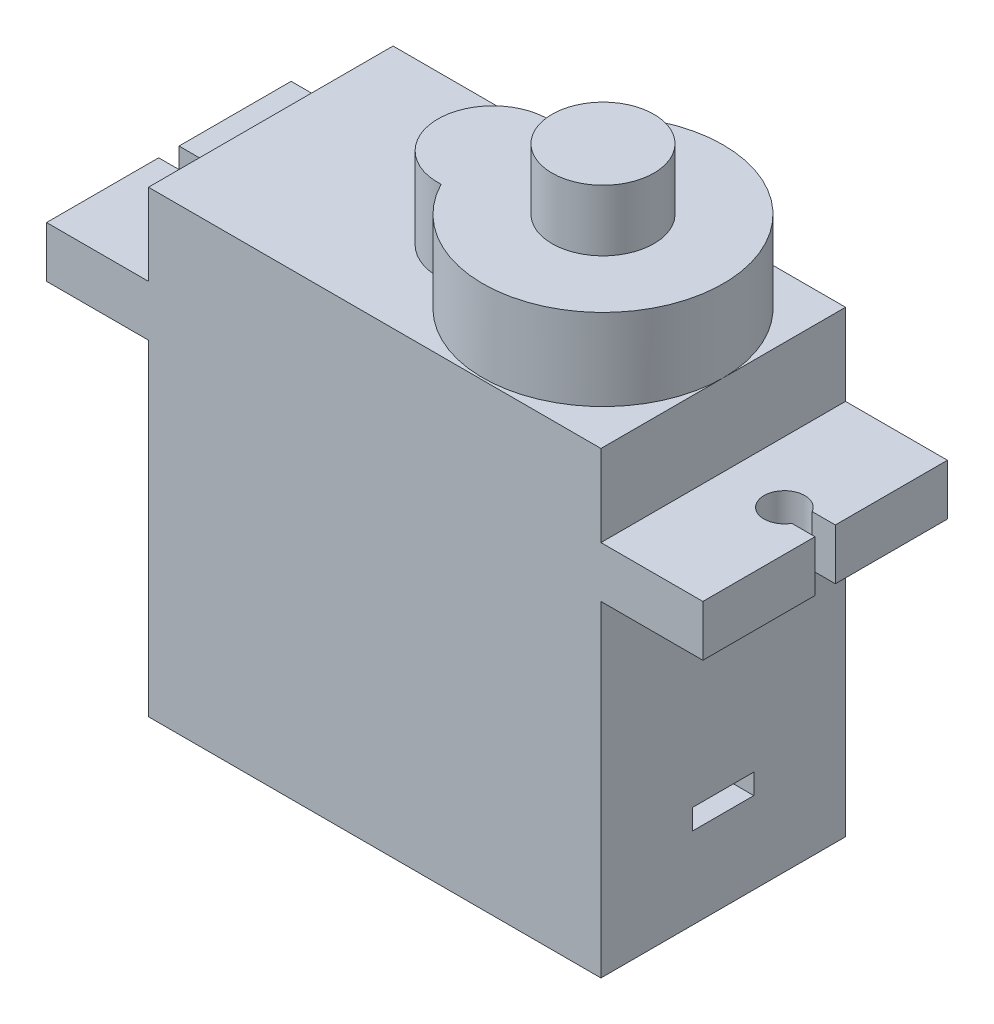
ISO-10303-21;
HEADER;
FILE_DESCRIPTION(('STEP AP214'),'2;1');
FILE_NAME('part.step','',(''),(''),'','','');
FILE_SCHEMA(('AUTOMOTIVE_DESIGN { 1 0 10303 214 1 1 1 1 }'));
ENDSEC;
DATA;
#1=APPLICATION_CONTEXT('core data for automotive mechanical design processes');
#2=APPLICATION_PROTOCOL_DEFINITION('international standard','automotive_design',2000,#1);
#3=PRODUCT_CONTEXT('',#1,'mechanical');
#4=PRODUCT('Part','Part','',(#3));
#5=PRODUCT_RELATED_PRODUCT_CATEGORY('part','',(#4));
#6=PRODUCT_DEFINITION_FORMATION('','',#4);
#7=PRODUCT_DEFINITION_CONTEXT('part definition',#1,'design');
#8=PRODUCT_DEFINITION('design','',#6,#7);
#9=PRODUCT_DEFINITION_SHAPE('','',#8);
#10=(LENGTH_UNIT() NAMED_UNIT(*) SI_UNIT(.MILLI.,.METRE.));
#11=(NAMED_UNIT(*) PLANE_ANGLE_UNIT() SI_UNIT($,.RADIAN.));
#12=(NAMED_UNIT(*) SI_UNIT($,.STERADIAN.) SOLID_ANGLE_UNIT());
#13=UNCERTAINTY_MEASURE_WITH_UNIT(LENGTH_MEASURE(1.E-05),#10,'distance_accuracy_value','');
#14=(GEOMETRIC_REPRESENTATION_CONTEXT(3) GLOBAL_UNCERTAINTY_ASSIGNED_CONTEXT((#13)) GLOBAL_UNIT_ASSIGNED_CONTEXT((#10,
#11,#12)) REPRESENTATION_CONTEXT('',''));
#15=CARTESIAN_POINT('',(0.,0.,0.));
#16=DIRECTION('',(0.,0.,1.));
#17=DIRECTION('',(1.,0.,0.));
#18=AXIS2_PLACEMENT_3D('',#15,#16,#17);
#19=CARTESIAN_POINT('',(22.2,16.,0.));
#20=DIRECTION('',(-1.,0.,0.));
#21=DIRECTION('',(0.,0.,1.));
#22=AXIS2_PLACEMENT_3D('',#19,#20,#21);
#23=PLANE('',#22);
#24=DIRECTION('',(0.,0.,-1.));
#25=VECTOR('',#24,1.);
#26=CARTESIAN_POINT('',(22.2,0.,0.));
#27=LINE('',#26,#25);
#28=CARTESIAN_POINT('',(22.2,0.,0.));
#29=VERTEX_POINT('',#28);
#30=CARTESIAN_POINT('',(22.2,0.,-12.));
#31=VERTEX_POINT('',#30);
#32=EDGE_CURVE('E328',#29,#31,#27,.T.);
#33=ORIENTED_EDGE('',*,*,#32,.T.);
#34=DIRECTION('',(0.,-1.,0.));
#35=VECTOR('',#34,1.);
#36=CARTESIAN_POINT('',(22.2,16.,-12.));
#37=LINE('',#36,#35);
#38=CARTESIAN_POINT('',(22.2,16.,-12.));
#39=VERTEX_POINT('',#38);
#40=EDGE_CURVE('E345',#39,#31,#37,.T.);
#41=ORIENTED_EDGE('',*,*,#40,.F.);
#42=DIRECTION('',(0.,0.,-1.));
#43=VECTOR('',#42,1.);
#44=CARTESIAN_POINT('',(22.2,16.,0.));
#45=LINE('',#44,#43);
#46=CARTESIAN_POINT('',(22.2,16.,0.));
#47=VERTEX_POINT('',#46);
#48=EDGE_CURVE('E358',#47,#39,#45,.T.);
#49=ORIENTED_EDGE('',*,*,#48,.F.);
#50=DIRECTION('',(0.,-1.,0.));
#51=VECTOR('',#50,1.);
#52=CARTESIAN_POINT('',(22.2,16.,0.));
#53=LINE('',#52,#51);
#54=EDGE_CURVE('E364',#47,#29,#53,.T.);
#55=ORIENTED_EDGE('',*,*,#54,.T.);
#56=EDGE_LOOP('',(#33,#41,#49,#55));
#57=FACE_BOUND('',#56,.T.);
#58=DIRECTION('',(0.,0.,-1.));
#59=VECTOR('',#58,1.);
#60=CARTESIAN_POINT('',(22.2,5.,0.));
#61=LINE('',#60,#59);
#62=CARTESIAN_POINT('',(22.2,5.,-4.5));
#63=VERTEX_POINT('',#62);
#64=CARTESIAN_POINT('',(22.2,5.,-7.5));
#65=VERTEX_POINT('',#64);
#66=EDGE_CURVE('E61',#63,#65,#61,.T.);
#67=ORIENTED_EDGE('',*,*,#66,.T.);
#68=DIRECTION('',(0.,-1.,0.));
#69=VECTOR('',#68,1.);
#70=CARTESIAN_POINT('',(22.2,0.,-7.5));
#71=LINE('',#70,#69);
#72=CARTESIAN_POINT('',(22.2,4.,-7.5));
#73=VERTEX_POINT('',#72);
#74=EDGE_CURVE('E238',#65,#73,#71,.T.);
#75=ORIENTED_EDGE('',*,*,#74,.T.);
#76=DIRECTION('',(0.,0.,-1.));
#77=VECTOR('',#76,1.);
#78=CARTESIAN_POINT('',(22.2,4.,0.));
#79=LINE('',#78,#77);
#80=CARTESIAN_POINT('',(22.2,4.,-4.5));
#81=VERTEX_POINT('',#80);
#82=EDGE_CURVE('E250',#81,#73,#79,.T.);
#83=ORIENTED_EDGE('',*,*,#82,.F.);
#84=DIRECTION('',(0.,-1.,0.));
#85=VECTOR('',#84,1.);
#86=CARTESIAN_POINT('',(22.2,0.,-4.5));
#87=LINE('',#86,#85);
#88=EDGE_CURVE('E248',#63,#81,#87,.T.);
#89=ORIENTED_EDGE('',*,*,#88,.F.);
#90=EDGE_LOOP('',(#67,#75,#83,#89));
#91=FACE_BOUND('',#90,.T.);
#92=ADVANCED_FACE('F44',(#57,#91),#23,.F.);
#93=CARTESIAN_POINT('',(-5.,18.5,0.));
#94=DIRECTION('',(1.,0.,0.));
#95=DIRECTION('',(0.,0.,-1.));
#96=AXIS2_PLACEMENT_3D('',#93,#94,#95);
#97=PLANE('',#96);
#98=DIRECTION('',(0.,1.,0.));
#99=VECTOR('',#98,1.);
#100=CARTESIAN_POINT('',(-5.,12.394448724536,-6.5));
#101=LINE('',#100,#99);
#102=CARTESIAN_POINT('',(-5.,16.,-6.5));
#103=VERTEX_POINT('',#102);
#104=CARTESIAN_POINT('',(-5.,18.5,-6.5));
#105=VERTEX_POINT('',#104);
#106=EDGE_CURVE('E282',#103,#105,#101,.T.);
#107=ORIENTED_EDGE('',*,*,#106,.T.);
#108=DIRECTION('',(0.,0.,1.));
#109=VECTOR('',#108,1.);
#110=CARTESIAN_POINT('',(-5.,18.5,0.));
#111=LINE('',#110,#109);
#112=CARTESIAN_POINT('',(-5.,18.5,-12.));
#113=VERTEX_POINT('',#112);
#114=EDGE_CURVE('E386',#113,#105,#111,.T.);
#115=ORIENTED_EDGE('',*,*,#114,.F.);
#116=DIRECTION('',(0.,-1.,0.));
#117=VECTOR('',#116,1.);
#118=CARTESIAN_POINT('',(-5.,18.5,-12.));
#119=LINE('',#118,#117);
#120=CARTESIAN_POINT('',(-5.,16.,-12.));
#121=VERTEX_POINT('',#120);
#122=EDGE_CURVE('E397',#113,#121,#119,.T.);
#123=ORIENTED_EDGE('',*,*,#122,.T.);
#124=DIRECTION('',(0.,0.,1.));
#125=VECTOR('',#124,1.);
#126=CARTESIAN_POINT('',(-5.,16.,0.));
#127=LINE('',#126,#125);
#128=EDGE_CURVE('E329',#121,#103,#127,.T.);
#129=ORIENTED_EDGE('',*,*,#128,.T.);
#130=EDGE_LOOP('',(#107,#115,#123,#129));
#131=FACE_BOUND('',#130,.T.);
#132=ADVANCED_FACE('F479',(#131),#97,.F.);
#133=CARTESIAN_POINT('',(0.,18.5,0.));
#134=DIRECTION('',(0.,1.,0.));
#135=DIRECTION('',(0.,0.,1.));
#136=AXIS2_PLACEMENT_3D('',#133,#134,#135);
#137=PLANE('',#136);
#138=ORIENTED_EDGE('',*,*,#114,.T.);
#139=DIRECTION('',(1.,0.,0.));
#140=VECTOR('',#139,1.);
#141=CARTESIAN_POINT('',(0.,18.5,-6.5));
#142=LINE('',#141,#140);
#143=CARTESIAN_POINT('',(-3.86602540378444,18.5,-6.5));
#144=VERTEX_POINT('',#143);
#145=EDGE_CURVE('E270',#105,#144,#142,.T.);
#146=ORIENTED_EDGE('',*,*,#145,.T.);
#147=CARTESIAN_POINT('',(-3.,18.5,-5.99999999999999));
#148=DIRECTION('',(0.,1.,0.));
#149=DIRECTION('',(0.,0.,1.));
#150=AXIS2_PLACEMENT_3D('',#147,#148,#149);
#151=CIRCLE('',#150,1.);
#152=CARTESIAN_POINT('',(-3.86602540378444,18.5,-5.5));
#153=VERTEX_POINT('',#152);
#154=EDGE_CURVE('E267',#153,#144,#151,.T.);
#155=ORIENTED_EDGE('',*,*,#154,.F.);
#156=DIRECTION('',(1.,0.,0.));
#157=VECTOR('',#156,1.);
#158=CARTESIAN_POINT('',(0.,18.5,-5.50000000000001));
#159=LINE('',#158,#157);
#160=CARTESIAN_POINT('',(-5.,18.5,-5.50000000000001));
#161=VERTEX_POINT('',#160);
#162=EDGE_CURVE('E274',#161,#153,#159,.T.);
#163=ORIENTED_EDGE('',*,*,#162,.F.);
#164=CARTESIAN_POINT('',(-5.,18.5,0.));
#165=VERTEX_POINT('',#164);
#166=EDGE_CURVE('E385',#161,#165,#111,.T.);
#167=ORIENTED_EDGE('',*,*,#166,.T.);
#168=DIRECTION('',(1.,0.,0.));
#169=VECTOR('',#168,1.);
#170=CARTESIAN_POINT('',(0.,18.5,0.));
#171=LINE('',#170,#169);
#172=CARTESIAN_POINT('',(0.,18.5,0.));
#173=VERTEX_POINT('',#172);
#174=EDGE_CURVE('E389',#165,#173,#171,.T.);
#175=ORIENTED_EDGE('',*,*,#174,.T.);
#176=DIRECTION('',(0.,0.,-1.));
#177=VECTOR('',#176,1.);
#178=CARTESIAN_POINT('',(0.,18.5,0.));
#179=LINE('',#178,#177);
#180=CARTESIAN_POINT('',(0.,18.5,-12.));
#181=VERTEX_POINT('',#180);
#182=EDGE_CURVE('E392',#173,#181,#179,.T.);
#183=ORIENTED_EDGE('',*,*,#182,.T.);
#184=DIRECTION('',(-1.,0.,0.));
#185=VECTOR('',#184,1.);
#186=CARTESIAN_POINT('',(0.,18.5,-12.));
#187=LINE('',#186,#185);
#188=EDGE_CURVE('E395',#181,#113,#187,.T.);
#189=ORIENTED_EDGE('',*,*,#188,.T.);
#190=EDGE_LOOP('',(#138,#146,#155,#163,#167,#175,#183,#189));
#191=FACE_BOUND('',#190,.T.);
#192=ADVANCED_FACE('F481',(#191),#137,.T.);
#193=CARTESIAN_POINT('',(27.2,18.5,0.));
#194=DIRECTION('',(-1.,0.,0.));
#195=DIRECTION('',(0.,0.,1.));
#196=AXIS2_PLACEMENT_3D('',#193,#194,#195);
#197=PLANE('',#196);
#198=DIRECTION('',(0.,1.,0.));
#199=VECTOR('',#198,1.);
#200=CARTESIAN_POINT('',(27.2,12.394448724536,-6.5));
#201=LINE('',#200,#199);
#202=CARTESIAN_POINT('',(27.2,16.,-6.5));
#203=VERTEX_POINT('',#202);
#204=CARTESIAN_POINT('',(27.2,18.5,-6.5));
#205=VERTEX_POINT('',#204);
#206=EDGE_CURVE('E291',#203,#205,#201,.T.);
#207=ORIENTED_EDGE('',*,*,#206,.F.);
#208=DIRECTION('',(0.,0.,-1.));
#209=VECTOR('',#208,1.);
#210=CARTESIAN_POINT('',(27.2,16.,0.));
#211=LINE('',#210,#209);
#212=CARTESIAN_POINT('',(27.2,16.,-12.));
#213=VERTEX_POINT('',#212);
#214=EDGE_CURVE('E355',#203,#213,#211,.T.);
#215=ORIENTED_EDGE('',*,*,#214,.T.);
#216=DIRECTION('',(0.,-1.,0.));
#217=VECTOR('',#216,1.);
#218=CARTESIAN_POINT('',(27.2,18.5,-12.));
#219=LINE('',#218,#217);
#220=CARTESIAN_POINT('',(27.2,18.5,-12.));
#221=VERTEX_POINT('',#220);
#222=EDGE_CURVE('E382',#221,#213,#219,.T.);
#223=ORIENTED_EDGE('',*,*,#222,.F.);
#224=DIRECTION('',(0.,0.,-1.));
#225=VECTOR('',#224,1.);
#226=CARTESIAN_POINT('',(27.2,18.5,0.));
#227=LINE('',#226,#225);
#228=EDGE_CURVE('E350',#205,#221,#227,.T.);
#229=ORIENTED_EDGE('',*,*,#228,.F.);
#230=EDGE_LOOP('',(#207,#215,#223,#229));
#231=FACE_BOUND('',#230,.T.);
#232=ADVANCED_FACE('F451',(#231),#197,.F.);
#233=CARTESIAN_POINT('',(0.,18.5,0.));
#234=DIRECTION('',(0.,1.,0.));
#235=DIRECTION('',(0.,0.,1.));
#236=AXIS2_PLACEMENT_3D('',#233,#234,#235);
#237=PLANE('',#236);
#238=CARTESIAN_POINT('',(25.2,18.5,-5.99999999999999));
#239=DIRECTION('',(0.,1.,0.));
#240=DIRECTION('',(0.,0.,1.));
#241=AXIS2_PLACEMENT_3D('',#238,#239,#240);
#242=CIRCLE('',#241,1.);
#243=CARTESIAN_POINT('',(26.0660254037844,18.5,-6.5));
#244=VERTEX_POINT('',#243);
#245=CARTESIAN_POINT('',(26.0660254037844,18.5,-5.5));
#246=VERTEX_POINT('',#245);
#247=EDGE_CURVE('E296',#244,#246,#242,.T.);
#248=ORIENTED_EDGE('',*,*,#247,.F.);
#249=DIRECTION('',(1.,0.,0.));
#250=VECTOR('',#249,1.);
#251=CARTESIAN_POINT('',(0.,18.5,-6.5));
#252=LINE('',#251,#250);
#253=EDGE_CURVE('E257',#244,#205,#252,.T.);
#254=ORIENTED_EDGE('',*,*,#253,.T.);
#255=ORIENTED_EDGE('',*,*,#228,.T.);
#256=DIRECTION('',(-1.,0.,0.));
#257=VECTOR('',#256,1.);
#258=CARTESIAN_POINT('',(0.,18.5,-12.));
#259=LINE('',#258,#257);
#260=CARTESIAN_POINT('',(22.2,18.5,-12.));
#261=VERTEX_POINT('',#260);
#262=EDGE_CURVE('E372',#221,#261,#259,.T.);
#263=ORIENTED_EDGE('',*,*,#262,.T.);
#264=DIRECTION('',(0.,0.,-1.));
#265=VECTOR('',#264,1.);
#266=CARTESIAN_POINT('',(22.2,18.5,0.));
#267=LINE('',#266,#265);
#268=CARTESIAN_POINT('',(22.2,18.5,0.));
#269=VERTEX_POINT('',#268);
#270=EDGE_CURVE('E374',#269,#261,#267,.T.);
#271=ORIENTED_EDGE('',*,*,#270,.F.);
#272=DIRECTION('',(1.,0.,0.));
#273=VECTOR('',#272,1.);
#274=CARTESIAN_POINT('',(0.,18.5,0.));
#275=LINE('',#274,#273);
#276=CARTESIAN_POINT('',(27.2,18.5,0.));
#277=VERTEX_POINT('',#276);
#278=EDGE_CURVE('E377',#269,#277,#275,.T.);
#279=ORIENTED_EDGE('',*,*,#278,.T.);
#280=CARTESIAN_POINT('',(27.2,18.5,-5.5));
#281=VERTEX_POINT('',#280);
#282=EDGE_CURVE('E369',#277,#281,#227,.T.);
#283=ORIENTED_EDGE('',*,*,#282,.T.);
#284=DIRECTION('',(1.,0.,0.));
#285=VECTOR('',#284,1.);
#286=CARTESIAN_POINT('',(0.,18.5,-5.5));
#287=LINE('',#286,#285);
#288=EDGE_CURVE('E298',#246,#281,#287,.T.);
#289=ORIENTED_EDGE('',*,*,#288,.F.);
#290=EDGE_LOOP('',(#248,#254,#255,#263,#271,#279,#283,#289));
#291=FACE_BOUND('',#290,.T.);
#292=ADVANCED_FACE('F444',(#291),#237,.T.);
#293=CARTESIAN_POINT('',(0.,16.,0.));
#294=DIRECTION('',(0.,1.,0.));
#295=DIRECTION('',(0.,0.,1.));
#296=AXIS2_PLACEMENT_3D('',#293,#294,#295);
#297=PLANE('',#296);
#298=DIRECTION('',(-1.,0.,0.));
#299=VECTOR('',#298,1.);
#300=CARTESIAN_POINT('',(0.,16.,-6.5));
#301=LINE('',#300,#299);
#302=CARTESIAN_POINT('',(26.0660254037844,16.,-6.5));
#303=VERTEX_POINT('',#302);
#304=EDGE_CURVE('E290',#203,#303,#301,.T.);
#305=ORIENTED_EDGE('',*,*,#304,.T.);
#306=CARTESIAN_POINT('',(25.2,16.,-5.99999999999999));
#307=DIRECTION('',(0.,1.,0.));
#308=DIRECTION('',(0.,0.,1.));
#309=AXIS2_PLACEMENT_3D('',#306,#307,#308);
#310=CIRCLE('',#309,1.);
#311=CARTESIAN_POINT('',(26.0660254037844,16.,-5.5));
#312=VERTEX_POINT('',#311);
#313=EDGE_CURVE('E271',#312,#303,#310,.F.);
#314=ORIENTED_EDGE('',*,*,#313,.F.);
#315=DIRECTION('',(-1.,0.,0.));
#316=VECTOR('',#315,1.);
#317=CARTESIAN_POINT('',(0.,16.,-5.5));
#318=LINE('',#317,#316);
#319=CARTESIAN_POINT('',(27.2,16.,-5.5));
#320=VERTEX_POINT('',#319);
#321=EDGE_CURVE('E288',#320,#312,#318,.T.);
#322=ORIENTED_EDGE('',*,*,#321,.F.);
#323=CARTESIAN_POINT('',(27.2,16.,0.));
#324=VERTEX_POINT('',#323);
#325=EDGE_CURVE('E351',#324,#320,#211,.T.);
#326=ORIENTED_EDGE('',*,*,#325,.F.);
#327=DIRECTION('',(1.,0.,0.));
#328=VECTOR('',#327,1.);
#329=CARTESIAN_POINT('',(0.,16.,0.));
#330=LINE('',#329,#328);
#331=EDGE_CURVE('E361',#47,#324,#330,.T.);
#332=ORIENTED_EDGE('',*,*,#331,.F.);
#333=ORIENTED_EDGE('',*,*,#48,.T.);
#334=DIRECTION('',(-1.,0.,0.));
#335=VECTOR('',#334,1.);
#336=CARTESIAN_POINT('',(0.,16.,-12.));
#337=LINE('',#336,#335);
#338=EDGE_CURVE('E354',#213,#39,#337,.T.);
#339=ORIENTED_EDGE('',*,*,#338,.F.);
#340=ORIENTED_EDGE('',*,*,#214,.F.);
#341=EDGE_LOOP('',(#305,#314,#322,#326,#332,#333,#339,#340));
#342=FACE_BOUND('',#341,.T.);
#343=ADVANCED_FACE('F455',(#342),#297,.F.);
#344=CARTESIAN_POINT('',(0.,16.,0.));
#345=DIRECTION('',(0.,1.,0.));
#346=DIRECTION('',(0.,0.,1.));
#347=AXIS2_PLACEMENT_3D('',#344,#345,#346);
#348=PLANE('',#347);
#349=DIRECTION('',(-1.,0.,0.));
#350=VECTOR('',#349,1.);
#351=CARTESIAN_POINT('',(0.,16.,-6.5));
#352=LINE('',#351,#350);
#353=CARTESIAN_POINT('',(-3.86602540378444,16.,-6.5));
#354=VERTEX_POINT('',#353);
#355=EDGE_CURVE('E264',#354,#103,#352,.T.);
#356=ORIENTED_EDGE('',*,*,#355,.T.);
#357=ORIENTED_EDGE('',*,*,#128,.F.);
#358=DIRECTION('',(-1.,0.,0.));
#359=VECTOR('',#358,1.);
#360=CARTESIAN_POINT('',(0.,16.,-12.));
#361=LINE('',#360,#359);
#362=CARTESIAN_POINT('',(0.,16.,-12.));
#363=VERTEX_POINT('',#362);
#364=EDGE_CURVE('E338',#363,#121,#361,.T.);
#365=ORIENTED_EDGE('',*,*,#364,.F.);
#366=DIRECTION('',(0.,0.,-1.));
#367=VECTOR('',#366,1.);
#368=CARTESIAN_POINT('',(0.,16.,0.));
#369=LINE('',#368,#367);
#370=CARTESIAN_POINT('',(0.,16.,0.));
#371=VERTEX_POINT('',#370);
#372=EDGE_CURVE('E336',#371,#363,#369,.T.);
#373=ORIENTED_EDGE('',*,*,#372,.F.);
#374=DIRECTION('',(1.,0.,0.));
#375=VECTOR('',#374,1.);
#376=CARTESIAN_POINT('',(0.,16.,0.));
#377=LINE('',#376,#375);
#378=CARTESIAN_POINT('',(-5.,16.,0.));
#379=VERTEX_POINT('',#378);
#380=EDGE_CURVE('E332',#379,#371,#377,.T.);
#381=ORIENTED_EDGE('',*,*,#380,.F.);
#382=CARTESIAN_POINT('',(-5.,16.,-5.50000000000001));
#383=VERTEX_POINT('',#382);
#384=EDGE_CURVE('E333',#383,#379,#127,.T.);
#385=ORIENTED_EDGE('',*,*,#384,.F.);
#386=DIRECTION('',(-1.,0.,0.));
#387=VECTOR('',#386,1.);
#388=CARTESIAN_POINT('',(0.,16.,-5.50000000000001));
#389=LINE('',#388,#387);
#390=CARTESIAN_POINT('',(-3.86602540378444,16.,-5.50000000000001));
#391=VERTEX_POINT('',#390);
#392=EDGE_CURVE('E261',#391,#383,#389,.T.);
#393=ORIENTED_EDGE('',*,*,#392,.F.);
#394=CARTESIAN_POINT('',(-3.,16.,-5.99999999999999));
#395=DIRECTION('',(0.,1.,0.));
#396=DIRECTION('',(0.,0.,1.));
#397=AXIS2_PLACEMENT_3D('',#394,#395,#396);
#398=CIRCLE('',#397,1.);
#399=EDGE_CURVE('E263',#354,#391,#398,.F.);
#400=ORIENTED_EDGE('',*,*,#399,.F.);
#401=EDGE_LOOP('',(#356,#357,#365,#373,#381,#385,#393,#400));
#402=FACE_BOUND('',#401,.T.);
#403=ADVANCED_FACE('F472',(#402),#348,.F.);
#404=CARTESIAN_POINT('',(0.,22.5,0.));
#405=DIRECTION('',(0.,0.,-1.));
#406=DIRECTION('',(-1.,0.,0.));
#407=AXIS2_PLACEMENT_3D('',#404,#405,#406);
#408=PLANE('',#407);
#409=DIRECTION('',(0.,-1.,0.));
#410=VECTOR('',#409,1.);
#411=CARTESIAN_POINT('',(0.,16.,0.));
#412=LINE('',#411,#410);
#413=CARTESIAN_POINT('',(0.,0.,0.));
#414=VERTEX_POINT('',#413);
#415=EDGE_CURVE('E347',#371,#414,#412,.T.);
#416=ORIENTED_EDGE('',*,*,#415,.T.);
#417=DIRECTION('',(1.,0.,0.));
#418=VECTOR('',#417,1.);
#419=CARTESIAN_POINT('',(0.,0.,0.));
#420=LINE('',#419,#418);
#421=EDGE_CURVE('E403',#414,#29,#420,.T.);
#422=ORIENTED_EDGE('',*,*,#421,.T.);
#423=ORIENTED_EDGE('',*,*,#54,.F.);
#424=ORIENTED_EDGE('',*,*,#331,.T.);
#425=DIRECTION('',(0.,-1.,0.));
#426=VECTOR('',#425,1.);
#427=CARTESIAN_POINT('',(27.2,18.5,0.));
#428=LINE('',#427,#426);
#429=EDGE_CURVE('E379',#277,#324,#428,.T.);
#430=ORIENTED_EDGE('',*,*,#429,.F.);
#431=ORIENTED_EDGE('',*,*,#278,.F.);
#432=DIRECTION('',(0.,-1.,0.));
#433=VECTOR('',#432,1.);
#434=CARTESIAN_POINT('',(22.2,22.5,0.));
#435=LINE('',#434,#433);
#436=CARTESIAN_POINT('',(22.2,22.5,0.));
#437=VERTEX_POINT('',#436);
#438=EDGE_CURVE('E48',#437,#269,#435,.T.);
#439=ORIENTED_EDGE('',*,*,#438,.F.);
#440=DIRECTION('',(1.,0.,0.));
#441=VECTOR('',#440,1.);
#442=CARTESIAN_POINT('',(0.,22.5,0.));
#443=LINE('',#442,#441);
#444=CARTESIAN_POINT('',(0.,22.5,0.));
#445=VERTEX_POINT('',#444);
#446=EDGE_CURVE('E404',#445,#437,#443,.T.);
#447=ORIENTED_EDGE('',*,*,#446,.F.);
#448=DIRECTION('',(0.,-1.,0.));
#449=VECTOR('',#448,1.);
#450=CARTESIAN_POINT('',(0.,22.5,0.));
#451=LINE('',#450,#449);
#452=EDGE_CURVE('E418',#445,#173,#451,.T.);
#453=ORIENTED_EDGE('',*,*,#452,.T.);
#454=ORIENTED_EDGE('',*,*,#174,.F.);
#455=DIRECTION('',(0.,-1.,0.));
#456=VECTOR('',#455,1.);
#457=CARTESIAN_POINT('',(-5.,18.5,0.));
#458=LINE('',#457,#456);
#459=EDGE_CURVE('E400',#165,#379,#458,.T.);
#460=ORIENTED_EDGE('',*,*,#459,.T.);
#461=ORIENTED_EDGE('',*,*,#380,.T.);
#462=EDGE_LOOP('',(#416,#422,#423,#424,#430,#431,#439,#447,#453,#454,#460,#461));
#463=FACE_BOUND('',#462,.T.);
#464=ADVANCED_FACE('F46',(#463),#408,.F.);
#465=CARTESIAN_POINT('',(0.,22.5,-12.));
#466=DIRECTION('',(0.,0.,-1.));
#467=DIRECTION('',(-1.,0.,0.));
#468=AXIS2_PLACEMENT_3D('',#465,#466,#467);
#469=PLANE('',#468);
#470=DIRECTION('',(1.,0.,0.));
#471=VECTOR('',#470,1.);
#472=CARTESIAN_POINT('',(0.,0.,-12.));
#473=LINE('',#472,#471);
#474=CARTESIAN_POINT('',(0.,0.,-12.));
#475=VERTEX_POINT('',#474);
#476=EDGE_CURVE('E408',#475,#31,#473,.T.);
#477=ORIENTED_EDGE('',*,*,#476,.F.);
#478=DIRECTION('',(0.,-1.,0.));
#479=VECTOR('',#478,1.);
#480=CARTESIAN_POINT('',(0.,16.,-12.));
#481=LINE('',#480,#479);
#482=EDGE_CURVE('E341',#363,#475,#481,.T.);
#483=ORIENTED_EDGE('',*,*,#482,.F.);
#484=ORIENTED_EDGE('',*,*,#364,.T.);
#485=ORIENTED_EDGE('',*,*,#122,.F.);
#486=ORIENTED_EDGE('',*,*,#188,.F.);
#487=DIRECTION('',(0.,-1.,0.));
#488=VECTOR('',#487,1.);
#489=CARTESIAN_POINT('',(0.,22.5,-12.));
#490=LINE('',#489,#488);
#491=CARTESIAN_POINT('',(0.,22.5,-12.));
#492=VERTEX_POINT('',#491);
#493=EDGE_CURVE('E425',#492,#181,#490,.T.);
#494=ORIENTED_EDGE('',*,*,#493,.F.);
#495=DIRECTION('',(1.,0.,0.));
#496=VECTOR('',#495,1.);
#497=CARTESIAN_POINT('',(0.,22.5,-12.));
#498=LINE('',#497,#496);
#499=CARTESIAN_POINT('',(22.2,22.5,-12.));
#500=VERTEX_POINT('',#499);
#501=EDGE_CURVE('E412',#492,#500,#498,.T.);
#502=ORIENTED_EDGE('',*,*,#501,.T.);
#503=DIRECTION('',(0.,-1.,0.));
#504=VECTOR('',#503,1.);
#505=CARTESIAN_POINT('',(22.2,22.5,-12.));
#506=LINE('',#505,#504);
#507=EDGE_CURVE('E426',#500,#261,#506,.T.);
#508=ORIENTED_EDGE('',*,*,#507,.T.);
#509=ORIENTED_EDGE('',*,*,#262,.F.);
#510=ORIENTED_EDGE('',*,*,#222,.T.);
#511=ORIENTED_EDGE('',*,*,#338,.T.);
#512=ORIENTED_EDGE('',*,*,#40,.T.);
#513=EDGE_LOOP('',(#477,#483,#484,#485,#486,#494,#502,#508,#509,#510,#511,#512));
#514=FACE_BOUND('',#513,.T.);
#515=ADVANCED_FACE('F448',(#514),#469,.T.);
#516=CARTESIAN_POINT('',(0.,0.,0.));
#517=DIRECTION('',(0.,1.,0.));
#518=DIRECTION('',(0.,0.,1.));
#519=AXIS2_PLACEMENT_3D('',#516,#517,#518);
#520=PLANE('',#519);
#521=DIRECTION('',(0.,0.,-1.));
#522=VECTOR('',#521,1.);
#523=CARTESIAN_POINT('',(0.,0.,0.));
#524=LINE('',#523,#522);
#525=EDGE_CURVE('E342',#414,#475,#524,.T.);
#526=ORIENTED_EDGE('',*,*,#525,.T.);
#527=ORIENTED_EDGE('',*,*,#476,.T.);
#528=ORIENTED_EDGE('',*,*,#32,.F.);
#529=ORIENTED_EDGE('',*,*,#421,.F.);
#530=EDGE_LOOP('',(#526,#527,#528,#529));
#531=FACE_BOUND('',#530,.T.);
#532=ADVANCED_FACE('F461',(#531),#520,.F.);
#533=CARTESIAN_POINT('',(22.2,22.5,0.));
#534=DIRECTION('',(-1.,0.,0.));
#535=DIRECTION('',(0.,0.,1.));
#536=AXIS2_PLACEMENT_3D('',#533,#534,#535);
#537=PLANE('',#536);
#538=ORIENTED_EDGE('',*,*,#438,.T.);
#539=ORIENTED_EDGE('',*,*,#270,.T.);
#540=ORIENTED_EDGE('',*,*,#507,.F.);
#541=DIRECTION('',(0.,0.,-1.));
#542=VECTOR('',#541,1.);
#543=CARTESIAN_POINT('',(22.2,22.5,0.));
#544=LINE('',#543,#542);
#545=CARTESIAN_POINT('',(22.2,22.5,-6.));
#546=VERTEX_POINT('',#545);
#547=EDGE_CURVE('E407',#546,#500,#544,.T.);
#548=ORIENTED_EDGE('',*,*,#547,.F.);
#549=EDGE_CURVE('E409',#437,#546,#544,.T.);
#550=ORIENTED_EDGE('',*,*,#549,.F.);
#551=EDGE_LOOP('',(#538,#539,#540,#548,#550));
#552=FACE_BOUND('',#551,.T.);
#553=ADVANCED_FACE('F434',(#552),#537,.F.);
#554=CARTESIAN_POINT('',(0.,22.5,0.));
#555=DIRECTION('',(-1.,0.,0.));
#556=DIRECTION('',(0.,0.,1.));
#557=AXIS2_PLACEMENT_3D('',#554,#555,#556);
#558=PLANE('',#557);
#559=ORIENTED_EDGE('',*,*,#182,.F.);
#560=ORIENTED_EDGE('',*,*,#452,.F.);
#561=DIRECTION('',(0.,0.,-1.));
#562=VECTOR('',#561,1.);
#563=CARTESIAN_POINT('',(0.,22.5,0.));
#564=LINE('',#563,#562);
#565=EDGE_CURVE('E415',#445,#492,#564,.T.);
#566=ORIENTED_EDGE('',*,*,#565,.T.);
#567=ORIENTED_EDGE('',*,*,#493,.T.);
#568=EDGE_LOOP('',(#559,#560,#566,#567));
#569=FACE_BOUND('',#568,.T.);
#570=ADVANCED_FACE('F487',(#569),#558,.T.);
#571=CARTESIAN_POINT('',(0.,22.5,0.));
#572=DIRECTION('',(0.,1.,0.));
#573=DIRECTION('',(0.,0.,1.));
#574=AXIS2_PLACEMENT_3D('',#571,#572,#573);
#575=PLANE('',#574);
#576=CARTESIAN_POINT('',(10.9,22.5,-6.));
#577=DIRECTION('',(0.,1.,0.));
#578=DIRECTION('',(0.,0.,1.));
#579=AXIS2_PLACEMENT_3D('',#576,#577,#578);
#580=CIRCLE('',#579,2.7);
#581=CARTESIAN_POINT('',(11.0518518518519,22.5,-8.69572643550661));
#582=VERTEX_POINT('',#581);
#583=CARTESIAN_POINT('',(11.0518518518519,22.5,-3.30427356449339));
#584=VERTEX_POINT('',#583);
#585=EDGE_CURVE('E313',#582,#584,#580,.T.);
#586=ORIENTED_EDGE('',*,*,#585,.F.);
#587=CARTESIAN_POINT('',(16.3,22.5,-6.));
#588=DIRECTION('',(0.,1.,0.));
#589=DIRECTION('',(0.,0.,1.));
#590=AXIS2_PLACEMENT_3D('',#587,#588,#589);
#591=CIRCLE('',#590,5.9);
#592=EDGE_CURVE('E11',#546,#582,#591,.T.);
#593=ORIENTED_EDGE('',*,*,#592,.F.);
#594=ORIENTED_EDGE('',*,*,#547,.T.);
#595=ORIENTED_EDGE('',*,*,#501,.F.);
#596=ORIENTED_EDGE('',*,*,#565,.F.);
#597=ORIENTED_EDGE('',*,*,#446,.T.);
#598=ORIENTED_EDGE('',*,*,#549,.T.);
#599=EDGE_CURVE('E54',#584,#546,#591,.T.);
#600=ORIENTED_EDGE('',*,*,#599,.F.);
#601=EDGE_LOOP('',(#586,#593,#594,#595,#596,#597,#598,#600));
#602=FACE_BOUND('',#601,.T.);
#603=ADVANCED_FACE('F486',(#602),#575,.T.);
#604=ORIENTED_EDGE('',*,*,#166,.F.);
#605=DIRECTION('',(0.,1.,0.));
#606=VECTOR('',#605,1.);
#607=CARTESIAN_POINT('',(-5.,12.394448724536,-5.50000000000001));
#608=LINE('',#607,#606);
#609=EDGE_CURVE('E280',#383,#161,#608,.T.);
#610=ORIENTED_EDGE('',*,*,#609,.F.);
#611=ORIENTED_EDGE('',*,*,#384,.T.);
#612=ORIENTED_EDGE('',*,*,#459,.F.);
#613=EDGE_LOOP('',(#604,#610,#611,#612));
#614=FACE_BOUND('',#613,.T.);
#615=ADVANCED_FACE('F492',(#614),#97,.F.);
#616=ORIENTED_EDGE('',*,*,#325,.T.);
#617=DIRECTION('',(0.,1.,0.));
#618=VECTOR('',#617,1.);
#619=CARTESIAN_POINT('',(27.2,12.394448724536,-5.5));
#620=LINE('',#619,#618);
#621=EDGE_CURVE('E302',#320,#281,#620,.T.);
#622=ORIENTED_EDGE('',*,*,#621,.T.);
#623=ORIENTED_EDGE('',*,*,#282,.F.);
#624=ORIENTED_EDGE('',*,*,#429,.T.);
#625=EDGE_LOOP('',(#616,#622,#623,#624));
#626=FACE_BOUND('',#625,.T.);
#627=ADVANCED_FACE('F528',(#626),#197,.F.);
#628=CARTESIAN_POINT('',(0.,16.,0.));
#629=DIRECTION('',(-1.,0.,0.));
#630=DIRECTION('',(0.,0.,1.));
#631=AXIS2_PLACEMENT_3D('',#628,#629,#630);
#632=PLANE('',#631);
#633=ORIENTED_EDGE('',*,*,#525,.F.);
#634=ORIENTED_EDGE('',*,*,#415,.F.);
#635=ORIENTED_EDGE('',*,*,#372,.T.);
#636=ORIENTED_EDGE('',*,*,#482,.T.);
#637=EDGE_LOOP('',(#633,#634,#635,#636));
#638=FACE_BOUND('',#637,.T.);
#639=ADVANCED_FACE('F464',(#638),#632,.T.);
#640=CARTESIAN_POINT('',(13.6,26.5,-6.));
#641=DIRECTION('',(0.,1.,0.));
#642=DIRECTION('',(0.,0.,1.));
#643=AXIS2_PLACEMENT_3D('',#640,#641,#642);
#644=PLANE('',#643);
#645=CARTESIAN_POINT('',(10.9,26.5,-6.));
#646=DIRECTION('',(0.,1.,0.));
#647=DIRECTION('',(0.,0.,1.));
#648=AXIS2_PLACEMENT_3D('',#645,#646,#647);
#649=CIRCLE('',#648,2.7);
#650=CARTESIAN_POINT('',(11.0518518518519,26.5,-8.69572643550661));
#651=VERTEX_POINT('',#650);
#652=CARTESIAN_POINT('',(11.0518518518519,26.5,-3.30427356449339));
#653=VERTEX_POINT('',#652);
#654=EDGE_CURVE('E314',#651,#653,#649,.T.);
#655=ORIENTED_EDGE('',*,*,#654,.T.);
#656=CARTESIAN_POINT('',(16.3,26.5,-6.));
#657=DIRECTION('',(0.,1.,0.));
#658=DIRECTION('',(0.,0.,1.));
#659=AXIS2_PLACEMENT_3D('',#656,#657,#658);
#660=CIRCLE('',#659,5.9);
#661=EDGE_CURVE('E317',#653,#651,#660,.T.);
#662=ORIENTED_EDGE('',*,*,#661,.T.);
#663=EDGE_LOOP('',(#655,#662));
#664=FACE_BOUND('',#663,.T.);
#665=CARTESIAN_POINT('',(16.3,26.5,-6.));
#666=DIRECTION('',(0.,1.,0.));
#667=DIRECTION('',(0.,0.,1.));
#668=AXIS2_PLACEMENT_3D('',#665,#666,#667);
#669=CIRCLE('',#668,2.5);
#670=CARTESIAN_POINT('',(16.3,26.5,-3.5));
#671=VERTEX_POINT('',#670);
#672=EDGE_CURVE('E310',#671,#671,#669,.T.);
#673=ORIENTED_EDGE('',*,*,#672,.F.);
#674=EDGE_LOOP('',(#673));
#675=FACE_BOUND('',#674,.T.);
#676=ADVANCED_FACE('F581',(#664,#675),#644,.T.);
#677=CARTESIAN_POINT('',(10.9,26.5,-6.));
#678=DIRECTION('',(0.,-1.,0.));
#679=DIRECTION('',(0.,0.,-1.));
#680=AXIS2_PLACEMENT_3D('',#677,#678,#679);
#681=CYLINDRICAL_SURFACE('',#680,2.7);
#682=ORIENTED_EDGE('',*,*,#585,.T.);
#683=DIRECTION('',(0.,-1.,0.));
#684=VECTOR('',#683,1.);
#685=CARTESIAN_POINT('',(11.0518518518519,26.5,-3.30427356449339));
#686=LINE('',#685,#684);
#687=EDGE_CURVE('E325',#653,#584,#686,.T.);
#688=ORIENTED_EDGE('',*,*,#687,.F.);
#689=ORIENTED_EDGE('',*,*,#654,.F.);
#690=DIRECTION('',(0.,-1.,0.));
#691=VECTOR('',#690,1.);
#692=CARTESIAN_POINT('',(11.0518518518519,26.5,-8.69572643550661));
#693=LINE('',#692,#691);
#694=EDGE_CURVE('E319',#651,#582,#693,.T.);
#695=ORIENTED_EDGE('',*,*,#694,.T.);
#696=EDGE_LOOP('',(#682,#688,#689,#695));
#697=FACE_BOUND('',#696,.T.);
#698=ADVANCED_FACE('F589',(#697),#681,.T.);
#699=CARTESIAN_POINT('',(16.3,26.5,-6.));
#700=DIRECTION('',(0.,-1.,0.));
#701=DIRECTION('',(0.,0.,-1.));
#702=AXIS2_PLACEMENT_3D('',#699,#700,#701);
#703=CYLINDRICAL_SURFACE('',#702,5.9);
#704=ORIENTED_EDGE('',*,*,#599,.T.);
#705=ORIENTED_EDGE('',*,*,#592,.T.);
#706=ORIENTED_EDGE('',*,*,#694,.F.);
#707=ORIENTED_EDGE('',*,*,#661,.F.);
#708=ORIENTED_EDGE('',*,*,#687,.T.);
#709=EDGE_LOOP('',(#704,#705,#706,#707,#708));
#710=FACE_BOUND('',#709,.T.);
#711=ADVANCED_FACE('F598',(#710),#703,.T.);
#712=CARTESIAN_POINT('',(16.3,29.5,-6.));
#713=DIRECTION('',(0.,-1.,0.));
#714=DIRECTION('',(0.,0.,-1.));
#715=AXIS2_PLACEMENT_3D('',#712,#713,#714);
#716=CYLINDRICAL_SURFACE('',#715,2.5);
#717=ORIENTED_EDGE('',*,*,#672,.T.);
#718=EDGE_LOOP('',(#717));
#719=FACE_BOUND('',#718,.T.);
#720=CARTESIAN_POINT('',(16.3,29.5,-6.));
#721=DIRECTION('',(0.,1.,0.));
#722=DIRECTION('',(0.,0.,1.));
#723=AXIS2_PLACEMENT_3D('',#720,#721,#722);
#724=CIRCLE('',#723,2.5);
#725=CARTESIAN_POINT('',(16.3,29.5,-3.5));
#726=VERTEX_POINT('',#725);
#727=EDGE_CURVE('E266',#726,#726,#724,.T.);
#728=ORIENTED_EDGE('',*,*,#727,.F.);
#729=EDGE_LOOP('',(#728));
#730=FACE_BOUND('',#729,.T.);
#731=ADVANCED_FACE('F511',(#719,#730),#716,.T.);
#732=CARTESIAN_POINT('',(0.,29.5,0.));
#733=DIRECTION('',(0.,1.,0.));
#734=DIRECTION('',(0.,0.,1.));
#735=AXIS2_PLACEMENT_3D('',#732,#733,#734);
#736=PLANE('',#735);
#737=ORIENTED_EDGE('',*,*,#727,.T.);
#738=EDGE_LOOP('',(#737));
#739=FACE_BOUND('',#738,.T.);
#740=ADVANCED_FACE('F503',(#739),#736,.T.);
#741=CARTESIAN_POINT('',(0.,12.394448724536,-6.5));
#742=DIRECTION('',(0.,0.,1.));
#743=DIRECTION('',(1.,0.,0.));
#744=AXIS2_PLACEMENT_3D('',#741,#742,#743);
#745=PLANE('',#744);
#746=DIRECTION('',(0.,1.,0.));
#747=VECTOR('',#746,1.);
#748=CARTESIAN_POINT('',(-3.86602540378444,12.394448724536,-6.5));
#749=LINE('',#748,#747);
#750=EDGE_CURVE('E277',#354,#144,#749,.T.);
#751=ORIENTED_EDGE('',*,*,#750,.T.);
#752=ORIENTED_EDGE('',*,*,#145,.F.);
#753=ORIENTED_EDGE('',*,*,#106,.F.);
#754=ORIENTED_EDGE('',*,*,#355,.F.);
#755=EDGE_LOOP('',(#751,#752,#753,#754));
#756=FACE_BOUND('',#755,.T.);
#757=ADVANCED_FACE('F501',(#756),#745,.T.);
#758=CARTESIAN_POINT('',(0.,12.394448724536,-5.50000000000001));
#759=DIRECTION('',(0.,0.,1.));
#760=DIRECTION('',(1.,0.,0.));
#761=AXIS2_PLACEMENT_3D('',#758,#759,#760);
#762=PLANE('',#761);
#763=ORIENTED_EDGE('',*,*,#392,.T.);
#764=ORIENTED_EDGE('',*,*,#609,.T.);
#765=ORIENTED_EDGE('',*,*,#162,.T.);
#766=DIRECTION('',(0.,1.,0.));
#767=VECTOR('',#766,1.);
#768=CARTESIAN_POINT('',(-3.86602540378444,12.394448724536,-5.5));
#769=LINE('',#768,#767);
#770=EDGE_CURVE('E278',#391,#153,#769,.T.);
#771=ORIENTED_EDGE('',*,*,#770,.F.);
#772=EDGE_LOOP('',(#763,#764,#765,#771));
#773=FACE_BOUND('',#772,.T.);
#774=ADVANCED_FACE('F494',(#773),#762,.F.);
#775=CARTESIAN_POINT('',(-3.,12.394448724536,-5.99999999999999));
#776=DIRECTION('',(0.,1.,0.));
#777=DIRECTION('',(0.,0.,1.));
#778=AXIS2_PLACEMENT_3D('',#775,#776,#777);
#779=CYLINDRICAL_SURFACE('',#778,1.);
#780=ORIENTED_EDGE('',*,*,#399,.T.);
#781=ORIENTED_EDGE('',*,*,#770,.T.);
#782=ORIENTED_EDGE('',*,*,#154,.T.);
#783=ORIENTED_EDGE('',*,*,#750,.F.);
#784=EDGE_LOOP('',(#780,#781,#782,#783));
#785=FACE_BOUND('',#784,.T.);
#786=ADVANCED_FACE('F499',(#785),#779,.F.);
#787=CARTESIAN_POINT('',(0.,12.394448724536,-6.5));
#788=DIRECTION('',(0.,0.,1.));
#789=DIRECTION('',(1.,0.,0.));
#790=AXIS2_PLACEMENT_3D('',#787,#788,#789);
#791=PLANE('',#790);
#792=ORIENTED_EDGE('',*,*,#206,.T.);
#793=ORIENTED_EDGE('',*,*,#253,.F.);
#794=DIRECTION('',(0.,1.,0.));
#795=VECTOR('',#794,1.);
#796=CARTESIAN_POINT('',(26.0660254037844,12.394448724536,-6.5));
#797=LINE('',#796,#795);
#798=EDGE_CURVE('E300',#303,#244,#797,.T.);
#799=ORIENTED_EDGE('',*,*,#798,.F.);
#800=ORIENTED_EDGE('',*,*,#304,.F.);
#801=EDGE_LOOP('',(#792,#793,#799,#800));
#802=FACE_BOUND('',#801,.T.);
#803=ADVANCED_FACE('F703',(#802),#791,.T.);
#804=CARTESIAN_POINT('',(0.,12.394448724536,-5.5));
#805=DIRECTION('',(0.,0.,1.));
#806=DIRECTION('',(1.,0.,0.));
#807=AXIS2_PLACEMENT_3D('',#804,#805,#806);
#808=PLANE('',#807);
#809=ORIENTED_EDGE('',*,*,#321,.T.);
#810=DIRECTION('',(0.,1.,0.));
#811=VECTOR('',#810,1.);
#812=CARTESIAN_POINT('',(26.0660254037844,12.394448724536,-5.5));
#813=LINE('',#812,#811);
#814=EDGE_CURVE('E69',#312,#246,#813,.T.);
#815=ORIENTED_EDGE('',*,*,#814,.T.);
#816=ORIENTED_EDGE('',*,*,#288,.T.);
#817=ORIENTED_EDGE('',*,*,#621,.F.);
#818=EDGE_LOOP('',(#809,#815,#816,#817));
#819=FACE_BOUND('',#818,.T.);
#820=ADVANCED_FACE('F707',(#819),#808,.F.);
#821=CARTESIAN_POINT('',(25.2,12.394448724536,-5.99999999999999));
#822=DIRECTION('',(0.,1.,0.));
#823=DIRECTION('',(0.,0.,1.));
#824=AXIS2_PLACEMENT_3D('',#821,#822,#823);
#825=CYLINDRICAL_SURFACE('',#824,1.);
#826=ORIENTED_EDGE('',*,*,#313,.T.);
#827=ORIENTED_EDGE('',*,*,#798,.T.);
#828=ORIENTED_EDGE('',*,*,#247,.T.);
#829=ORIENTED_EDGE('',*,*,#814,.F.);
#830=EDGE_LOOP('',(#826,#827,#828,#829));
#831=FACE_BOUND('',#830,.T.);
#832=ADVANCED_FACE('F712',(#831),#825,.F.);
#833=CARTESIAN_POINT('',(19.2,5.,0.));
#834=DIRECTION('',(0.,-1.,0.));
#835=DIRECTION('',(0.,0.,-1.));
#836=AXIS2_PLACEMENT_3D('',#833,#834,#835);
#837=PLANE('',#836);
#838=ORIENTED_EDGE('',*,*,#66,.F.);
#839=DIRECTION('',(1.,0.,0.));
#840=VECTOR('',#839,1.);
#841=CARTESIAN_POINT('',(19.2,5.,-4.5));
#842=LINE('',#841,#840);
#843=CARTESIAN_POINT('',(19.2,5.,-4.5));
#844=VERTEX_POINT('',#843);
#845=EDGE_CURVE('E221',#844,#63,#842,.T.);
#846=ORIENTED_EDGE('',*,*,#845,.F.);
#847=DIRECTION('',(0.,0.,-1.));
#848=VECTOR('',#847,1.);
#849=CARTESIAN_POINT('',(19.2,5.,0.));
#850=LINE('',#849,#848);
#851=CARTESIAN_POINT('',(19.2,5.,-7.5));
#852=VERTEX_POINT('',#851);
#853=EDGE_CURVE('E224',#844,#852,#850,.T.);
#854=ORIENTED_EDGE('',*,*,#853,.T.);
#855=DIRECTION('',(1.,0.,0.));
#856=VECTOR('',#855,1.);
#857=CARTESIAN_POINT('',(19.2,5.,-7.5));
#858=LINE('',#857,#856);
#859=EDGE_CURVE('E255',#852,#65,#858,.T.);
#860=ORIENTED_EDGE('',*,*,#859,.T.);
#861=EDGE_LOOP('',(#838,#846,#854,#860));
#862=FACE_BOUND('',#861,.T.);
#863=ADVANCED_FACE('F223',(#862),#837,.T.);
#864=CARTESIAN_POINT('',(19.2,0.,-7.5));
#865=DIRECTION('',(0.,0.,1.));
#866=DIRECTION('',(0.,-1.,0.));
#867=AXIS2_PLACEMENT_3D('',#864,#865,#866);
#868=PLANE('',#867);
#869=ORIENTED_EDGE('',*,*,#74,.F.);
#870=ORIENTED_EDGE('',*,*,#859,.F.);
#871=DIRECTION('',(0.,-1.,0.));
#872=VECTOR('',#871,1.);
#873=CARTESIAN_POINT('',(19.2,0.,-7.5));
#874=LINE('',#873,#872);
#875=CARTESIAN_POINT('',(19.2,4.,-7.5));
#876=VERTEX_POINT('',#875);
#877=EDGE_CURVE('E231',#852,#876,#874,.T.);
#878=ORIENTED_EDGE('',*,*,#877,.T.);
#879=DIRECTION('',(1.,0.,0.));
#880=VECTOR('',#879,1.);
#881=CARTESIAN_POINT('',(19.2,4.,-7.5));
#882=LINE('',#881,#880);
#883=EDGE_CURVE('E258',#876,#73,#882,.T.);
#884=ORIENTED_EDGE('',*,*,#883,.T.);
#885=EDGE_LOOP('',(#869,#870,#878,#884));
#886=FACE_BOUND('',#885,.T.);
#887=ADVANCED_FACE('F734',(#886),#868,.T.);
#888=CARTESIAN_POINT('',(19.2,4.,0.));
#889=DIRECTION('',(0.,-1.,0.));
#890=DIRECTION('',(0.,0.,-1.));
#891=AXIS2_PLACEMENT_3D('',#888,#889,#890);
#892=PLANE('',#891);
#893=ORIENTED_EDGE('',*,*,#82,.T.);
#894=ORIENTED_EDGE('',*,*,#883,.F.);
#895=DIRECTION('',(0.,0.,-1.));
#896=VECTOR('',#895,1.);
#897=CARTESIAN_POINT('',(19.2,4.,0.));
#898=LINE('',#897,#896);
#899=CARTESIAN_POINT('',(19.2,4.,-4.5));
#900=VERTEX_POINT('',#899);
#901=EDGE_CURVE('E242',#900,#876,#898,.T.);
#902=ORIENTED_EDGE('',*,*,#901,.F.);
#903=DIRECTION('',(1.,0.,0.));
#904=VECTOR('',#903,1.);
#905=CARTESIAN_POINT('',(19.2,4.,-4.5));
#906=LINE('',#905,#904);
#907=EDGE_CURVE('E230',#900,#81,#906,.T.);
#908=ORIENTED_EDGE('',*,*,#907,.T.);
#909=EDGE_LOOP('',(#893,#894,#902,#908));
#910=FACE_BOUND('',#909,.T.);
#911=ADVANCED_FACE('F741',(#910),#892,.F.);
#912=CARTESIAN_POINT('',(19.2,0.,-4.5));
#913=DIRECTION('',(0.,0.,1.));
#914=DIRECTION('',(1.,0.,0.));
#915=AXIS2_PLACEMENT_3D('',#912,#913,#914);
#916=PLANE('',#915);
#917=ORIENTED_EDGE('',*,*,#88,.T.);
#918=ORIENTED_EDGE('',*,*,#907,.F.);
#919=DIRECTION('',(0.,-1.,0.));
#920=VECTOR('',#919,1.);
#921=CARTESIAN_POINT('',(19.2,0.,-4.5));
#922=LINE('',#921,#920);
#923=EDGE_CURVE('E237',#844,#900,#922,.T.);
#924=ORIENTED_EDGE('',*,*,#923,.F.);
#925=ORIENTED_EDGE('',*,*,#845,.T.);
#926=EDGE_LOOP('',(#917,#918,#924,#925));
#927=FACE_BOUND('',#926,.T.);
#928=ADVANCED_FACE('F240',(#927),#916,.F.);
#929=CARTESIAN_POINT('',(19.2,0.,0.));
#930=DIRECTION('',(1.,0.,0.));
#931=DIRECTION('',(0.,0.,-1.));
#932=AXIS2_PLACEMENT_3D('',#929,#930,#931);
#933=PLANE('',#932);
#934=ORIENTED_EDGE('',*,*,#853,.F.);
#935=ORIENTED_EDGE('',*,*,#923,.T.);
#936=ORIENTED_EDGE('',*,*,#901,.T.);
#937=ORIENTED_EDGE('',*,*,#877,.F.);
#938=EDGE_LOOP('',(#934,#935,#936,#937));
#939=FACE_BOUND('',#938,.T.);
#940=ADVANCED_FACE('F235',(#939),#933,.T.);
#941=CLOSED_SHELL('',(#92,#132,#192,#232,#292,#343,#403,#464,#515,#532,#553,#570,#603,#615,#627,
#639,#676,#698,#711,#731,#740,#757,#774,#786,#803,#820,#832,#863,#887,#911,#928,#940));
#942=MANIFOLD_SOLID_BREP('B2',#941);
#943=ADVANCED_BREP_SHAPE_REPRESENTATION('',(#18,#942),#14);
#944=SHAPE_DEFINITION_REPRESENTATION(#9,#943);
ENDSEC;
END-ISO-10303-21;
